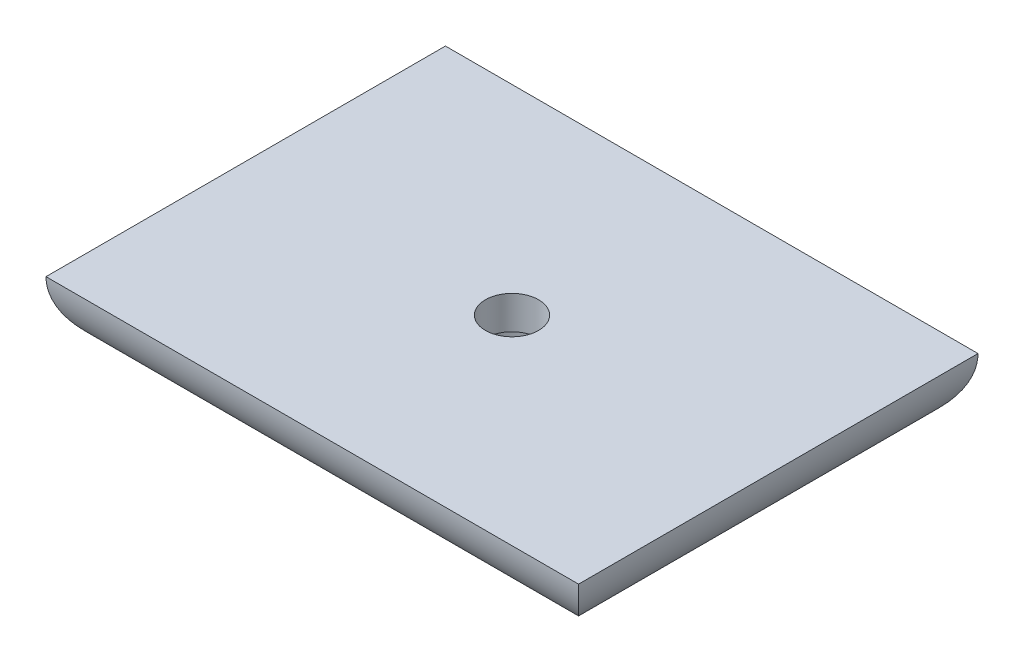
ISO-10303-21;
HEADER;
FILE_DESCRIPTION(('STEP AP214'),'2;1');
FILE_NAME('part.step','',(''),(''),'','','');
FILE_SCHEMA(('AUTOMOTIVE_DESIGN { 1 0 10303 214 1 1 1 1 }'));
ENDSEC;
DATA;
#1=APPLICATION_CONTEXT('core data for automotive mechanical design processes');
#2=APPLICATION_PROTOCOL_DEFINITION('international standard','automotive_design',2000,#1);
#3=PRODUCT_CONTEXT('',#1,'mechanical');
#4=PRODUCT('Part','Part','',(#3));
#5=PRODUCT_RELATED_PRODUCT_CATEGORY('part','',(#4));
#6=PRODUCT_DEFINITION_FORMATION('','',#4);
#7=PRODUCT_DEFINITION_CONTEXT('part definition',#1,'design');
#8=PRODUCT_DEFINITION('design','',#6,#7);
#9=PRODUCT_DEFINITION_SHAPE('','',#8);
#10=(LENGTH_UNIT() NAMED_UNIT(*) SI_UNIT(.MILLI.,.METRE.));
#11=(NAMED_UNIT(*) PLANE_ANGLE_UNIT() SI_UNIT($,.RADIAN.));
#12=(NAMED_UNIT(*) SI_UNIT($,.STERADIAN.) SOLID_ANGLE_UNIT());
#13=UNCERTAINTY_MEASURE_WITH_UNIT(LENGTH_MEASURE(1.E-05),#10,'distance_accuracy_value','');
#14=(GEOMETRIC_REPRESENTATION_CONTEXT(3) GLOBAL_UNCERTAINTY_ASSIGNED_CONTEXT((#13)) GLOBAL_UNIT_ASSIGNED_CONTEXT((#10,
#11,#12)) REPRESENTATION_CONTEXT('',''));
#15=CARTESIAN_POINT('',(0.,0.,0.));
#16=DIRECTION('',(0.,0.,1.));
#17=DIRECTION('',(1.,0.,0.));
#18=AXIS2_PLACEMENT_3D('',#15,#16,#17);
#19=CARTESIAN_POINT('',(0.,5.,0.));
#20=DIRECTION('',(0.,-1.,0.));
#21=DIRECTION('',(0.,0.,-1.));
#22=AXIS2_PLACEMENT_3D('',#19,#20,#21);
#23=CYLINDRICAL_SURFACE('',#22,2.);
#24=CARTESIAN_POINT('',(0.,5.,0.));
#25=DIRECTION('',(0.,1.,0.));
#26=DIRECTION('',(0.,0.,1.));
#27=AXIS2_PLACEMENT_3D('',#24,#25,#26);
#28=CIRCLE('',#27,2.);
#29=CARTESIAN_POINT('',(0.,5.,2.));
#30=VERTEX_POINT('',#29);
#31=EDGE_CURVE('E95',#30,#30,#28,.T.);
#32=ORIENTED_EDGE('',*,*,#31,.T.);
#33=EDGE_LOOP('',(#32));
#34=FACE_BOUND('',#33,.T.);
#35=CARTESIAN_POINT('',(0.,2.5,0.));
#36=DIRECTION('',(0.,-1.,0.));
#37=DIRECTION('',(0.,0.,-1.));
#38=AXIS2_PLACEMENT_3D('',#35,#36,#37);
#39=CIRCLE('',#38,2.);
#40=CARTESIAN_POINT('',(0.,2.5,-2.));
#41=VERTEX_POINT('',#40);
#42=EDGE_CURVE('E37',#41,#41,#39,.T.);
#43=ORIENTED_EDGE('',*,*,#42,.T.);
#44=EDGE_LOOP('',(#43));
#45=FACE_BOUND('',#44,.T.);
#46=ADVANCED_FACE('F33',(#34,#45),#23,.F.);
#47=CARTESIAN_POINT('',(0.,5.,0.));
#48=DIRECTION('',(0.,-1.,0.));
#49=DIRECTION('',(0.,0.,-1.));
#50=AXIS2_PLACEMENT_3D('',#47,#48,#49);
#51=PLANE('',#50);
#52=DIRECTION('',(0.,0.,1.));
#53=VECTOR('',#52,1.);
#54=CARTESIAN_POINT('',(-20.,5.,-15.));
#55=LINE('',#54,#53);
#56=CARTESIAN_POINT('',(-20.,5.,-15.));
#57=VERTEX_POINT('',#56);
#58=CARTESIAN_POINT('',(-20.,5.,15.));
#59=VERTEX_POINT('',#58);
#60=EDGE_CURVE('E78',#57,#59,#55,.T.);
#61=ORIENTED_EDGE('',*,*,#60,.T.);
#62=DIRECTION('',(1.,0.,0.));
#63=VECTOR('',#62,1.);
#64=CARTESIAN_POINT('',(20.,5.,15.));
#65=LINE('',#64,#63);
#66=CARTESIAN_POINT('',(20.,5.,15.));
#67=VERTEX_POINT('',#66);
#68=EDGE_CURVE('E83',#59,#67,#65,.T.);
#69=ORIENTED_EDGE('',*,*,#68,.T.);
#70=DIRECTION('',(0.,0.,-1.));
#71=VECTOR('',#70,1.);
#72=CARTESIAN_POINT('',(20.,5.,-15.));
#73=LINE('',#72,#71);
#74=CARTESIAN_POINT('',(20.,5.,-15.));
#75=VERTEX_POINT('',#74);
#76=EDGE_CURVE('E89',#67,#75,#73,.T.);
#77=ORIENTED_EDGE('',*,*,#76,.T.);
#78=DIRECTION('',(-1.,0.,0.));
#79=VECTOR('',#78,1.);
#80=CARTESIAN_POINT('',(20.,5.,-15.));
#81=LINE('',#80,#79);
#82=EDGE_CURVE('E94',#75,#57,#81,.T.);
#83=ORIENTED_EDGE('',*,*,#82,.T.);
#84=EDGE_LOOP('',(#61,#69,#77,#83));
#85=FACE_BOUND('',#84,.T.);
#86=ORIENTED_EDGE('',*,*,#31,.F.);
#87=EDGE_LOOP('',(#86));
#88=FACE_BOUND('',#87,.T.);
#89=ADVANCED_FACE('F91',(#85,#88),#51,.F.);
#90=CARTESIAN_POINT('',(0.,0.,0.));
#91=DIRECTION('',(0.,-1.,0.));
#92=DIRECTION('',(0.,0.,-1.));
#93=AXIS2_PLACEMENT_3D('',#90,#91,#92);
#94=PLANE('',#93);
#95=CARTESIAN_POINT('',(0.,0.,0.));
#96=DIRECTION('',(0.,-1.,0.));
#97=DIRECTION('',(0.,0.,-1.));
#98=AXIS2_PLACEMENT_3D('',#95,#96,#97);
#99=CIRCLE('',#98,4.);
#100=CARTESIAN_POINT('',(0.,0.,-4.));
#101=VERTEX_POINT('',#100);
#102=EDGE_CURVE('E148',#101,#101,#99,.T.);
#103=ORIENTED_EDGE('',*,*,#102,.F.);
#104=EDGE_LOOP('',(#103));
#105=FACE_BOUND('',#104,.T.);
#106=DIRECTION('',(1.,0.,0.));
#107=VECTOR('',#106,1.);
#108=CARTESIAN_POINT('',(-20.,0.,10.));
#109=LINE('',#108,#107);
#110=CARTESIAN_POINT('',(15.,0.,10.));
#111=VERTEX_POINT('',#110);
#112=CARTESIAN_POINT('',(-15.,0.,10.));
#113=VERTEX_POINT('',#112);
#114=EDGE_CURVE('E104',#111,#113,#109,.F.);
#115=ORIENTED_EDGE('',*,*,#114,.T.);
#116=DIRECTION('',(0.,0.,1.));
#117=VECTOR('',#116,1.);
#118=CARTESIAN_POINT('',(-15.,0.,-15.));
#119=LINE('',#118,#117);
#120=CARTESIAN_POINT('',(-15.,0.,-10.));
#121=VERTEX_POINT('',#120);
#122=EDGE_CURVE('E11',#113,#121,#119,.F.);
#123=ORIENTED_EDGE('',*,*,#122,.T.);
#124=DIRECTION('',(-1.,0.,0.));
#125=VECTOR('',#124,1.);
#126=CARTESIAN_POINT('',(20.,0.,-10.));
#127=LINE('',#126,#125);
#128=CARTESIAN_POINT('',(15.,0.,-10.));
#129=VERTEX_POINT('',#128);
#130=EDGE_CURVE('E42',#121,#129,#127,.F.);
#131=ORIENTED_EDGE('',*,*,#130,.T.);
#132=DIRECTION('',(0.,0.,-1.));
#133=VECTOR('',#132,1.);
#134=CARTESIAN_POINT('',(15.,0.,15.));
#135=LINE('',#134,#133);
#136=EDGE_CURVE('E106',#129,#111,#135,.F.);
#137=ORIENTED_EDGE('',*,*,#136,.T.);
#138=EDGE_LOOP('',(#115,#123,#131,#137));
#139=FACE_BOUND('',#138,.T.);
#140=ADVANCED_FACE('F115',(#105,#139),#94,.T.);
#141=CARTESIAN_POINT('',(15.,5.,-15.));
#142=DIRECTION('',(0.,0.,1.));
#143=DIRECTION('',(1.,0.,0.));
#144=AXIS2_PLACEMENT_3D('',#141,#142,#143);
#145=CYLINDRICAL_SURFACE('',#144,5.);
#146=CARTESIAN_POINT('',(15.,5.,10.));
#147=DIRECTION('',(-0.707106781186547,0.,0.707106781186548));
#148=DIRECTION('',(-0.707106781186548,0.,-0.707106781186547));
#149=AXIS2_PLACEMENT_3D('',#146,#147,#148);
#150=ELLIPSE('',#149,7.07106781186548,5.);
#151=EDGE_CURVE('E86',#111,#67,#150,.T.);
#152=ORIENTED_EDGE('',*,*,#151,.F.);
#153=ORIENTED_EDGE('',*,*,#136,.F.);
#154=CARTESIAN_POINT('',(15.,5.,-10.));
#155=DIRECTION('',(0.707106781186548,0.,0.707106781186547));
#156=DIRECTION('',(-0.707106781186547,0.,0.707106781186548));
#157=AXIS2_PLACEMENT_3D('',#154,#155,#156);
#158=ELLIPSE('',#157,7.07106781186547,5.);
#159=EDGE_CURVE('E98',#75,#129,#158,.F.);
#160=ORIENTED_EDGE('',*,*,#159,.F.);
#161=ORIENTED_EDGE('',*,*,#76,.F.);
#162=EDGE_LOOP('',(#152,#153,#160,#161));
#163=FACE_BOUND('',#162,.T.);
#164=ADVANCED_FACE('F35',(#163),#145,.T.);
#165=CARTESIAN_POINT('',(20.,5.,-10.));
#166=DIRECTION('',(1.,0.,0.));
#167=DIRECTION('',(0.,0.,-1.));
#168=AXIS2_PLACEMENT_3D('',#165,#166,#167);
#169=CYLINDRICAL_SURFACE('',#168,5.);
#170=ORIENTED_EDGE('',*,*,#159,.T.);
#171=ORIENTED_EDGE('',*,*,#130,.F.);
#172=CARTESIAN_POINT('',(-15.,5.,-10.));
#173=DIRECTION('',(0.707106781186547,0.,-0.707106781186548));
#174=DIRECTION('',(0.707106781186548,0.,0.707106781186547));
#175=AXIS2_PLACEMENT_3D('',#172,#173,#174);
#176=ELLIPSE('',#175,7.07106781186548,5.);
#177=EDGE_CURVE('E50',#57,#121,#176,.F.);
#178=ORIENTED_EDGE('',*,*,#177,.F.);
#179=ORIENTED_EDGE('',*,*,#82,.F.);
#180=EDGE_LOOP('',(#170,#171,#178,#179));
#181=FACE_BOUND('',#180,.T.);
#182=ADVANCED_FACE('F113',(#181),#169,.T.);
#183=CARTESIAN_POINT('',(20.,5.,10.));
#184=DIRECTION('',(-1.,0.,0.));
#185=DIRECTION('',(0.,0.,1.));
#186=AXIS2_PLACEMENT_3D('',#183,#184,#185);
#187=CYLINDRICAL_SURFACE('',#186,5.);
#188=ORIENTED_EDGE('',*,*,#151,.T.);
#189=ORIENTED_EDGE('',*,*,#68,.F.);
#190=CARTESIAN_POINT('',(-15.,5.,10.));
#191=DIRECTION('',(-0.707106781186548,0.,-0.707106781186547));
#192=DIRECTION('',(-0.707106781186547,0.,0.707106781186548));
#193=AXIS2_PLACEMENT_3D('',#190,#191,#192);
#194=ELLIPSE('',#193,7.07106781186547,5.);
#195=EDGE_CURVE('E74',#113,#59,#194,.T.);
#196=ORIENTED_EDGE('',*,*,#195,.F.);
#197=ORIENTED_EDGE('',*,*,#114,.F.);
#198=EDGE_LOOP('',(#188,#189,#196,#197));
#199=FACE_BOUND('',#198,.T.);
#200=ADVANCED_FACE('F84',(#199),#187,.T.);
#201=CARTESIAN_POINT('',(-15.,5.,-15.));
#202=DIRECTION('',(0.,0.,-1.));
#203=DIRECTION('',(-1.,0.,0.));
#204=AXIS2_PLACEMENT_3D('',#201,#202,#203);
#205=CYLINDRICAL_SURFACE('',#204,5.);
#206=ORIENTED_EDGE('',*,*,#177,.T.);
#207=ORIENTED_EDGE('',*,*,#122,.F.);
#208=ORIENTED_EDGE('',*,*,#195,.T.);
#209=ORIENTED_EDGE('',*,*,#60,.F.);
#210=EDGE_LOOP('',(#206,#207,#208,#209));
#211=FACE_BOUND('',#210,.T.);
#212=ADVANCED_FACE('F76',(#211),#205,.T.);
#213=CARTESIAN_POINT('',(0.,2.5,0.));
#214=DIRECTION('',(0.,-1.,0.));
#215=DIRECTION('',(0.,0.,-1.));
#216=AXIS2_PLACEMENT_3D('',#213,#214,#215);
#217=CYLINDRICAL_SURFACE('',#216,4.);
#218=CARTESIAN_POINT('',(0.,2.5,0.));
#219=DIRECTION('',(0.,-1.,0.));
#220=DIRECTION('',(0.,0.,-1.));
#221=AXIS2_PLACEMENT_3D('',#218,#219,#220);
#222=CIRCLE('',#221,4.);
#223=CARTESIAN_POINT('',(0.,2.5,-4.));
#224=VERTEX_POINT('',#223);
#225=EDGE_CURVE('E147',#224,#224,#222,.T.);
#226=ORIENTED_EDGE('',*,*,#225,.F.);
#227=EDGE_LOOP('',(#226));
#228=FACE_BOUND('',#227,.T.);
#229=ORIENTED_EDGE('',*,*,#102,.T.);
#230=EDGE_LOOP('',(#229));
#231=FACE_BOUND('',#230,.T.);
#232=ADVANCED_FACE('F133',(#228,#231),#217,.F.);
#233=CARTESIAN_POINT('',(0.,2.5,0.));
#234=DIRECTION('',(0.,-1.,0.));
#235=DIRECTION('',(0.,0.,-1.));
#236=AXIS2_PLACEMENT_3D('',#233,#234,#235);
#237=PLANE('',#236);
#238=ORIENTED_EDGE('',*,*,#42,.F.);
#239=EDGE_LOOP('',(#238));
#240=FACE_BOUND('',#239,.T.);
#241=ORIENTED_EDGE('',*,*,#225,.T.);
#242=EDGE_LOOP('',(#241));
#243=FACE_BOUND('',#242,.T.);
#244=ADVANCED_FACE('F136',(#240,#243),#237,.T.);
#245=CLOSED_SHELL('',(#46,#89,#140,#164,#182,#200,#212,#232,#244));
#246=MANIFOLD_SOLID_BREP('B2',#245);
#247=ADVANCED_BREP_SHAPE_REPRESENTATION('',(#18,#246),#14);
#248=SHAPE_DEFINITION_REPRESENTATION(#9,#247);
ENDSEC;
END-ISO-10303-21;
